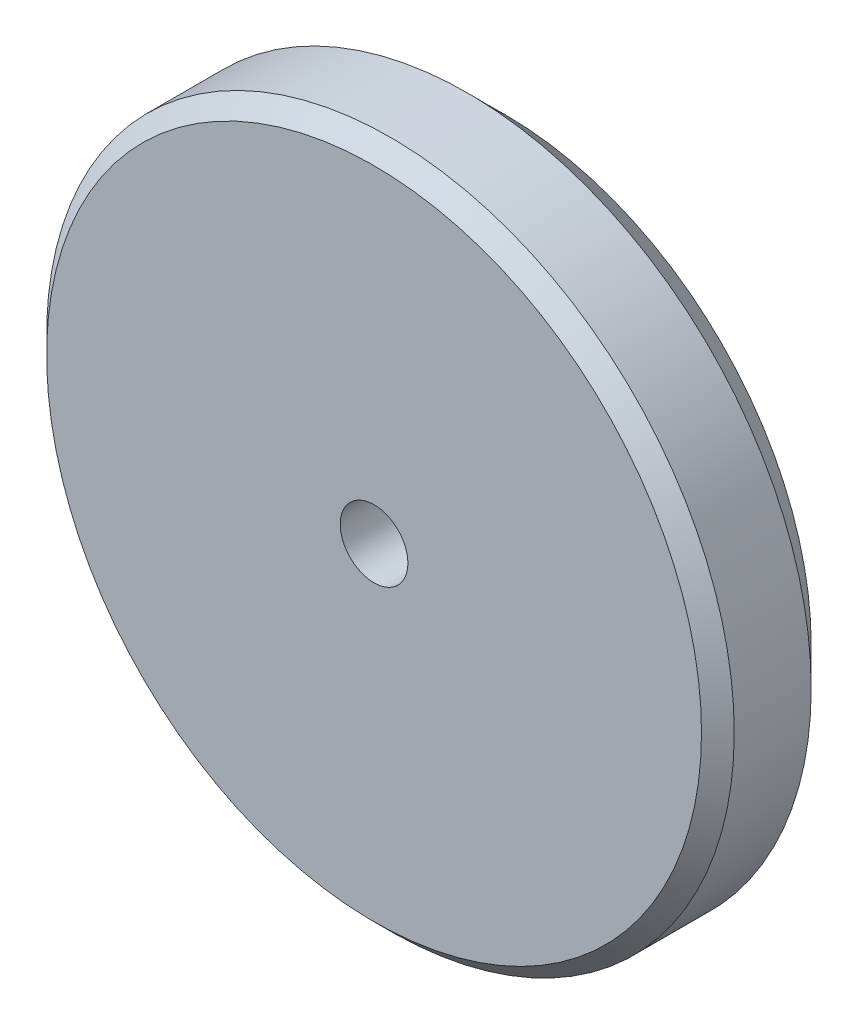
ISO-10303-21;
HEADER;
FILE_DESCRIPTION(('STEP AP214'),'2;1');
FILE_NAME('part.step','',(''),(''),'','','');
FILE_SCHEMA(('AUTOMOTIVE_DESIGN { 1 0 10303 214 1 1 1 1 }'));
ENDSEC;
DATA;
#1=APPLICATION_CONTEXT('core data for automotive mechanical design processes');
#2=APPLICATION_PROTOCOL_DEFINITION('international standard','automotive_design',2000,#1);
#3=PRODUCT_CONTEXT('',#1,'mechanical');
#4=PRODUCT('Part','Part','',(#3));
#5=PRODUCT_RELATED_PRODUCT_CATEGORY('part','',(#4));
#6=PRODUCT_DEFINITION_FORMATION('','',#4);
#7=PRODUCT_DEFINITION_CONTEXT('part definition',#1,'design');
#8=PRODUCT_DEFINITION('design','',#6,#7);
#9=PRODUCT_DEFINITION_SHAPE('','',#8);
#10=(LENGTH_UNIT() NAMED_UNIT(*) SI_UNIT(.MILLI.,.METRE.));
#11=(NAMED_UNIT(*) PLANE_ANGLE_UNIT() SI_UNIT($,.RADIAN.));
#12=(NAMED_UNIT(*) SI_UNIT($,.STERADIAN.) SOLID_ANGLE_UNIT());
#13=UNCERTAINTY_MEASURE_WITH_UNIT(LENGTH_MEASURE(1.E-05),#10,'distance_accuracy_value','');
#14=(GEOMETRIC_REPRESENTATION_CONTEXT(3) GLOBAL_UNCERTAINTY_ASSIGNED_CONTEXT((#13)) GLOBAL_UNIT_ASSIGNED_CONTEXT((#10,
#11,#12)) REPRESENTATION_CONTEXT('',''));
#15=CARTESIAN_POINT('',(0.,0.,0.));
#16=DIRECTION('',(0.,0.,1.));
#17=DIRECTION('',(1.,0.,0.));
#18=AXIS2_PLACEMENT_3D('',#15,#16,#17);
#19=CARTESIAN_POINT('',(0.,0.,0.));
#20=DIRECTION('',(0.,0.,-1.));
#21=DIRECTION('',(0.,-1.,0.));
#22=AXIS2_PLACEMENT_3D('',#19,#20,#21);
#23=PLANE('',#22);
#24=CARTESIAN_POINT('',(0.,0.,0.));
#25=DIRECTION('',(0.,0.,1.));
#26=DIRECTION('',(-1.,0.,0.));
#27=AXIS2_PLACEMENT_3D('',#24,#25,#26);
#28=CIRCLE('',#27,4.);
#29=CARTESIAN_POINT('',(4.,0.,0.));
#30=VERTEX_POINT('',#29);
#31=EDGE_CURVE('E102',#30,#30,#28,.T.);
#32=ORIENTED_EDGE('',*,*,#31,.T.);
#33=EDGE_LOOP('',(#32));
#34=FACE_BOUND('',#33,.T.);
#35=CARTESIAN_POINT('',(15.,0.,0.));
#36=DIRECTION('',(0.,0.,1.));
#37=DIRECTION('',(-1.,0.,0.));
#38=AXIS2_PLACEMENT_3D('',#35,#36,#37);
#39=CIRCLE('',#38,2.5);
#40=CARTESIAN_POINT('',(17.5,0.,0.));
#41=VERTEX_POINT('',#40);
#42=EDGE_CURVE('E137',#41,#41,#39,.T.);
#43=ORIENTED_EDGE('',*,*,#42,.T.);
#44=EDGE_LOOP('',(#43));
#45=FACE_BOUND('',#44,.T.);
#46=CARTESIAN_POINT('',(-15.,0.,0.));
#47=DIRECTION('',(0.,0.,1.));
#48=DIRECTION('',(-1.,0.,0.));
#49=AXIS2_PLACEMENT_3D('',#46,#47,#48);
#50=CIRCLE('',#49,2.5);
#51=CARTESIAN_POINT('',(-12.5,0.,0.));
#52=VERTEX_POINT('',#51);
#53=EDGE_CURVE('E172',#52,#52,#50,.T.);
#54=ORIENTED_EDGE('',*,*,#53,.T.);
#55=EDGE_LOOP('',(#54));
#56=FACE_BOUND('',#55,.T.);
#57=CARTESIAN_POINT('',(0.,0.,0.));
#58=DIRECTION('',(0.,0.,1.));
#59=DIRECTION('',(-1.,0.,0.));
#60=AXIS2_PLACEMENT_3D('',#57,#58,#59);
#61=CIRCLE('',#60,18.7);
#62=CARTESIAN_POINT('',(18.7,0.,0.));
#63=VERTEX_POINT('',#62);
#64=EDGE_CURVE('E11',#63,#63,#61,.T.);
#65=ORIENTED_EDGE('',*,*,#64,.F.);
#66=EDGE_LOOP('',(#65));
#67=FACE_BOUND('',#66,.T.);
#68=ADVANCED_FACE('F17',(#34,#45,#56,#67),#23,.T.);
#69=CARTESIAN_POINT('',(0.,0.,1.15));
#70=DIRECTION('',(0.,0.,1.));
#71=DIRECTION('',(-1.,0.,0.));
#72=AXIS2_PLACEMENT_3D('',#69,#70,#71);
#73=CONICAL_SURFACE('',#72,19.85,0.785398163397449);
#74=CARTESIAN_POINT('',(0.,0.,2.3));
#75=DIRECTION('',(0.,0.,-1.));
#76=DIRECTION('',(-1.,0.,0.));
#77=AXIS2_PLACEMENT_3D('',#74,#75,#76);
#78=CIRCLE('',#77,21.);
#79=CARTESIAN_POINT('',(21.,0.,2.3));
#80=VERTEX_POINT('',#79);
#81=EDGE_CURVE('E132',#80,#80,#78,.T.);
#82=ORIENTED_EDGE('',*,*,#81,.T.);
#83=DIRECTION('',(-0.707106781186548,0.,-0.707106781186547));
#84=VECTOR('',#83,1.);
#85=CARTESIAN_POINT('',(19.85,0.,1.15));
#86=LINE('',#85,#84);
#87=EDGE_CURVE('E28',#80,#63,#86,.T.);
#88=ORIENTED_EDGE('',*,*,#87,.T.);
#89=ORIENTED_EDGE('',*,*,#64,.T.);
#90=ORIENTED_EDGE('',*,*,#87,.F.);
#91=EDGE_LOOP('',(#82,#88,#89,#90));
#92=FACE_BOUND('',#91,.T.);
#93=ADVANCED_FACE('F203',(#92),#73,.T.);
#94=CARTESIAN_POINT('',(0.,0.,8.));
#95=DIRECTION('',(0.,0.,-1.));
#96=DIRECTION('',(0.,-1.,0.));
#97=AXIS2_PLACEMENT_3D('',#94,#95,#96);
#98=PLANE('',#97);
#99=CARTESIAN_POINT('',(0.,0.,8.));
#100=DIRECTION('',(0.,0.,-1.));
#101=DIRECTION('',(-1.,0.,0.));
#102=AXIS2_PLACEMENT_3D('',#99,#100,#101);
#103=CIRCLE('',#102,2.067);
#104=CARTESIAN_POINT('',(2.067,0.,8.));
#105=VERTEX_POINT('',#104);
#106=EDGE_CURVE('E115',#105,#105,#103,.T.);
#107=ORIENTED_EDGE('',*,*,#106,.T.);
#108=EDGE_LOOP('',(#107));
#109=FACE_BOUND('',#108,.T.);
#110=CARTESIAN_POINT('',(0.,0.,8.));
#111=DIRECTION('',(0.,0.,-1.));
#112=DIRECTION('',(-1.,0.,0.));
#113=AXIS2_PLACEMENT_3D('',#110,#111,#112);
#114=CIRCLE('',#113,20.);
#115=CARTESIAN_POINT('',(20.,0.,8.));
#116=VERTEX_POINT('',#115);
#117=EDGE_CURVE('E152',#116,#116,#114,.T.);
#118=ORIENTED_EDGE('',*,*,#117,.F.);
#119=EDGE_LOOP('',(#118));
#120=FACE_BOUND('',#119,.T.);
#121=ADVANCED_FACE('F296',(#109,#120),#98,.F.);
#122=CARTESIAN_POINT('',(0.,0.,0.));
#123=DIRECTION('',(0.,0.,1.));
#124=DIRECTION('',(-1.,0.,0.));
#125=AXIS2_PLACEMENT_3D('',#122,#123,#124);
#126=CYLINDRICAL_SURFACE('',#125,21.);
#127=CARTESIAN_POINT('',(0.,0.,7.));
#128=DIRECTION('',(0.,0.,1.));
#129=DIRECTION('',(-1.,0.,0.));
#130=AXIS2_PLACEMENT_3D('',#127,#128,#129);
#131=CIRCLE('',#130,21.);
#132=CARTESIAN_POINT('',(21.,0.,7.));
#133=VERTEX_POINT('',#132);
#134=EDGE_CURVE('E117',#133,#133,#131,.T.);
#135=ORIENTED_EDGE('',*,*,#134,.F.);
#136=DIRECTION('',(0.,0.,-1.));
#137=VECTOR('',#136,1.);
#138=CARTESIAN_POINT('',(21.,0.,0.));
#139=LINE('',#138,#137);
#140=EDGE_CURVE('E158',#133,#80,#139,.T.);
#141=ORIENTED_EDGE('',*,*,#140,.T.);
#142=ORIENTED_EDGE('',*,*,#81,.F.);
#143=ORIENTED_EDGE('',*,*,#140,.F.);
#144=EDGE_LOOP('',(#135,#141,#142,#143));
#145=FACE_BOUND('',#144,.T.);
#146=ADVANCED_FACE('F299',(#145),#126,.T.);
#147=CARTESIAN_POINT('',(0.,0.,7.5));
#148=DIRECTION('',(0.,0.,-1.));
#149=DIRECTION('',(-1.,0.,0.));
#150=AXIS2_PLACEMENT_3D('',#147,#148,#149);
#151=CONICAL_SURFACE('',#150,20.5,0.785398163397449);
#152=ORIENTED_EDGE('',*,*,#134,.T.);
#153=DIRECTION('',(-0.707106781186548,0.,0.707106781186547));
#154=VECTOR('',#153,1.);
#155=CARTESIAN_POINT('',(20.5,0.,7.5));
#156=LINE('',#155,#154);
#157=EDGE_CURVE('E149',#133,#116,#156,.T.);
#158=ORIENTED_EDGE('',*,*,#157,.T.);
#159=ORIENTED_EDGE('',*,*,#117,.T.);
#160=ORIENTED_EDGE('',*,*,#157,.F.);
#161=EDGE_LOOP('',(#152,#158,#159,#160));
#162=FACE_BOUND('',#161,.T.);
#163=ADVANCED_FACE('F284',(#162),#151,.T.);
#164=CARTESIAN_POINT('',(0.,0.,59.9332962550868));
#165=DIRECTION('',(0.,0.,-1.));
#166=DIRECTION('',(-1.,0.,0.));
#167=AXIS2_PLACEMENT_3D('',#164,#165,#166);
#168=CYLINDRICAL_SURFACE('',#167,2.067);
#169=ORIENTED_EDGE('',*,*,#106,.F.);
#170=DIRECTION('',(0.,0.,-1.));
#171=VECTOR('',#170,1.);
#172=CARTESIAN_POINT('',(2.067,0.,59.9332962550868));
#173=LINE('',#172,#171);
#174=CARTESIAN_POINT('',(2.067,0.,1.933));
#175=VERTEX_POINT('',#174);
#176=EDGE_CURVE('E109',#105,#175,#173,.T.);
#177=ORIENTED_EDGE('',*,*,#176,.T.);
#178=CARTESIAN_POINT('',(0.,0.,1.933));
#179=DIRECTION('',(0.,0.,-1.));
#180=DIRECTION('',(-1.,0.,0.));
#181=AXIS2_PLACEMENT_3D('',#178,#179,#180);
#182=CIRCLE('',#181,2.067);
#183=EDGE_CURVE('E113',#175,#175,#182,.T.);
#184=ORIENTED_EDGE('',*,*,#183,.T.);
#185=ORIENTED_EDGE('',*,*,#176,.F.);
#186=EDGE_LOOP('',(#169,#177,#184,#185));
#187=FACE_BOUND('',#186,.T.);
#188=ADVANCED_FACE('F111',(#187),#168,.F.);
#189=CARTESIAN_POINT('',(0.,0.,0.9665));
#190=DIRECTION('',(0.,0.,-1.));
#191=DIRECTION('',(-1.,0.,0.));
#192=AXIS2_PLACEMENT_3D('',#189,#190,#191);
#193=CONICAL_SURFACE('',#192,3.0335,0.785398163397448);
#194=ORIENTED_EDGE('',*,*,#183,.F.);
#195=DIRECTION('',(0.707106781186547,0.,-0.707106781186548));
#196=VECTOR('',#195,1.);
#197=CARTESIAN_POINT('',(3.0335,0.,0.9665));
#198=LINE('',#197,#196);
#199=EDGE_CURVE('E121',#175,#30,#198,.T.);
#200=ORIENTED_EDGE('',*,*,#199,.T.);
#201=ORIENTED_EDGE('',*,*,#31,.F.);
#202=ORIENTED_EDGE('',*,*,#199,.F.);
#203=EDGE_LOOP('',(#194,#200,#201,#202));
#204=FACE_BOUND('',#203,.T.);
#205=ADVANCED_FACE('F19',(#204),#193,.F.);
#206=CARTESIAN_POINT('',(15.,0.,2.5));
#207=DIRECTION('',(0.,0.,-1.));
#208=DIRECTION('',(-1.,0.,0.));
#209=AXIS2_PLACEMENT_3D('',#206,#207,#208);
#210=CYLINDRICAL_SURFACE('',#209,2.);
#211=CARTESIAN_POINT('',(15.,0.,5.));
#212=DIRECTION('',(0.,0.,-1.));
#213=DIRECTION('',(-1.,0.,0.));
#214=AXIS2_PLACEMENT_3D('',#211,#212,#213);
#215=CIRCLE('',#214,2.);
#216=CARTESIAN_POINT('',(17.,0.,5.));
#217=VERTEX_POINT('',#216);
#218=EDGE_CURVE('E141',#217,#217,#215,.T.);
#219=ORIENTED_EDGE('',*,*,#218,.F.);
#220=DIRECTION('',(0.,0.,-1.));
#221=VECTOR('',#220,1.);
#222=CARTESIAN_POINT('',(17.,0.,2.5));
#223=LINE('',#222,#221);
#224=CARTESIAN_POINT('',(17.,0.,0.5));
#225=VERTEX_POINT('',#224);
#226=EDGE_CURVE('E85',#217,#225,#223,.T.);
#227=ORIENTED_EDGE('',*,*,#226,.T.);
#228=CARTESIAN_POINT('',(15.,0.,0.5));
#229=DIRECTION('',(0.,0.,-1.));
#230=DIRECTION('',(-1.,0.,0.));
#231=AXIS2_PLACEMENT_3D('',#228,#229,#230);
#232=CIRCLE('',#231,2.);
#233=EDGE_CURVE('E144',#225,#225,#232,.T.);
#234=ORIENTED_EDGE('',*,*,#233,.T.);
#235=ORIENTED_EDGE('',*,*,#226,.F.);
#236=EDGE_LOOP('',(#219,#227,#234,#235));
#237=FACE_BOUND('',#236,.T.);
#238=ADVANCED_FACE('F264',(#237),#210,.F.);
#239=CARTESIAN_POINT('',(15.,0.,0.25));
#240=DIRECTION('',(0.,0.,-1.));
#241=DIRECTION('',(-1.,0.,0.));
#242=AXIS2_PLACEMENT_3D('',#239,#240,#241);
#243=CONICAL_SURFACE('',#242,2.25,0.785398163397448);
#244=ORIENTED_EDGE('',*,*,#233,.F.);
#245=DIRECTION('',(0.707106781186547,0.,-0.707106781186548));
#246=VECTOR('',#245,1.);
#247=CARTESIAN_POINT('',(17.25,0.,0.25));
#248=LINE('',#247,#246);
#249=EDGE_CURVE('E139',#225,#41,#248,.T.);
#250=ORIENTED_EDGE('',*,*,#249,.T.);
#251=ORIENTED_EDGE('',*,*,#42,.F.);
#252=ORIENTED_EDGE('',*,*,#249,.F.);
#253=EDGE_LOOP('',(#244,#250,#251,#252));
#254=FACE_BOUND('',#253,.T.);
#255=ADVANCED_FACE('F267',(#254),#243,.F.);
#256=CARTESIAN_POINT('',(15.,0.,5.60086061902756));
#257=DIRECTION('',(0.,0.,-1.));
#258=DIRECTION('',(-1.,0.,0.));
#259=AXIS2_PLACEMENT_3D('',#256,#257,#258);
#260=CONICAL_SURFACE('',#259,1.,1.02974425867665);
#261=DIRECTION('',(0.857167300702112,0.,-0.515038074910054));
#262=VECTOR('',#261,1.);
#263=CARTESIAN_POINT('',(16.,0.,5.60086061902756));
#264=LINE('',#263,#262);
#265=CARTESIAN_POINT('',(15.,0.,6.20172123805512));
#266=VERTEX_POINT('',#265);
#267=EDGE_CURVE('E95',#266,#217,#264,.T.);
#268=ORIENTED_EDGE('',*,*,#267,.T.);
#269=ORIENTED_EDGE('',*,*,#218,.T.);
#270=ORIENTED_EDGE('',*,*,#267,.F.);
#271=EDGE_LOOP('',(#268,#269,#270));
#272=FACE_BOUND('',#271,.T.);
#273=ADVANCED_FACE('F271',(#272),#260,.F.);
#274=CARTESIAN_POINT('',(-15.,0.,2.5));
#275=DIRECTION('',(0.,0.,-1.));
#276=DIRECTION('',(-1.,0.,0.));
#277=AXIS2_PLACEMENT_3D('',#274,#275,#276);
#278=CYLINDRICAL_SURFACE('',#277,2.);
#279=CARTESIAN_POINT('',(-15.,0.,5.));
#280=DIRECTION('',(0.,0.,-1.));
#281=DIRECTION('',(-1.,0.,0.));
#282=AXIS2_PLACEMENT_3D('',#279,#280,#281);
#283=CIRCLE('',#282,2.);
#284=CARTESIAN_POINT('',(-13.,0.,5.));
#285=VERTEX_POINT('',#284);
#286=EDGE_CURVE('E181',#285,#285,#283,.T.);
#287=ORIENTED_EDGE('',*,*,#286,.F.);
#288=DIRECTION('',(0.,0.,-1.));
#289=VECTOR('',#288,1.);
#290=CARTESIAN_POINT('',(-13.,0.,2.5));
#291=LINE('',#290,#289);
#292=CARTESIAN_POINT('',(-13.,0.,0.5));
#293=VERTEX_POINT('',#292);
#294=EDGE_CURVE('E174',#285,#293,#291,.T.);
#295=ORIENTED_EDGE('',*,*,#294,.T.);
#296=CARTESIAN_POINT('',(-15.,0.,0.5));
#297=DIRECTION('',(0.,0.,-1.));
#298=DIRECTION('',(-1.,0.,0.));
#299=AXIS2_PLACEMENT_3D('',#296,#297,#298);
#300=CIRCLE('',#299,2.);
#301=EDGE_CURVE('E21',#293,#293,#300,.T.);
#302=ORIENTED_EDGE('',*,*,#301,.T.);
#303=ORIENTED_EDGE('',*,*,#294,.F.);
#304=EDGE_LOOP('',(#287,#295,#302,#303));
#305=FACE_BOUND('',#304,.T.);
#306=ADVANCED_FACE('F195',(#305),#278,.F.);
#307=CARTESIAN_POINT('',(-15.,0.,0.25));
#308=DIRECTION('',(0.,0.,-1.));
#309=DIRECTION('',(-1.,0.,0.));
#310=AXIS2_PLACEMENT_3D('',#307,#308,#309);
#311=CONICAL_SURFACE('',#310,2.25,0.785398163397448);
#312=ORIENTED_EDGE('',*,*,#301,.F.);
#313=DIRECTION('',(0.707106781186547,0.,-0.707106781186548));
#314=VECTOR('',#313,1.);
#315=CARTESIAN_POINT('',(-12.75,0.,0.25));
#316=LINE('',#315,#314);
#317=EDGE_CURVE('E169',#293,#52,#316,.T.);
#318=ORIENTED_EDGE('',*,*,#317,.T.);
#319=ORIENTED_EDGE('',*,*,#53,.F.);
#320=ORIENTED_EDGE('',*,*,#317,.F.);
#321=EDGE_LOOP('',(#312,#318,#319,#320));
#322=FACE_BOUND('',#321,.T.);
#323=ADVANCED_FACE('F198',(#322),#311,.F.);
#324=CARTESIAN_POINT('',(-15.,0.,5.60086061902756));
#325=DIRECTION('',(0.,0.,-1.));
#326=DIRECTION('',(-1.,0.,0.));
#327=AXIS2_PLACEMENT_3D('',#324,#325,#326);
#328=CONICAL_SURFACE('',#327,1.,1.02974425867665);
#329=DIRECTION('',(0.857167300702112,0.,-0.515038074910054));
#330=VECTOR('',#329,1.);
#331=CARTESIAN_POINT('',(-14.,0.,5.60086061902756));
#332=LINE('',#331,#330);
#333=CARTESIAN_POINT('',(-15.,0.,6.20172123805512));
#334=VERTEX_POINT('',#333);
#335=EDGE_CURVE('E177',#334,#285,#332,.T.);
#336=ORIENTED_EDGE('',*,*,#335,.T.);
#337=ORIENTED_EDGE('',*,*,#286,.T.);
#338=ORIENTED_EDGE('',*,*,#335,.F.);
#339=EDGE_LOOP('',(#336,#337,#338));
#340=FACE_BOUND('',#339,.T.);
#341=ADVANCED_FACE('F286',(#340),#328,.F.);
#342=CLOSED_SHELL('',(#68,#93,#121,#146,#163,#188,#205,#238,#255,#273,#306,#323,#341));
#343=MANIFOLD_SOLID_BREP('B1',#342);
#344=ADVANCED_BREP_SHAPE_REPRESENTATION('',(#18,#343),#14);
#345=SHAPE_DEFINITION_REPRESENTATION(#9,#344);
ENDSEC;
END-ISO-10303-21;
